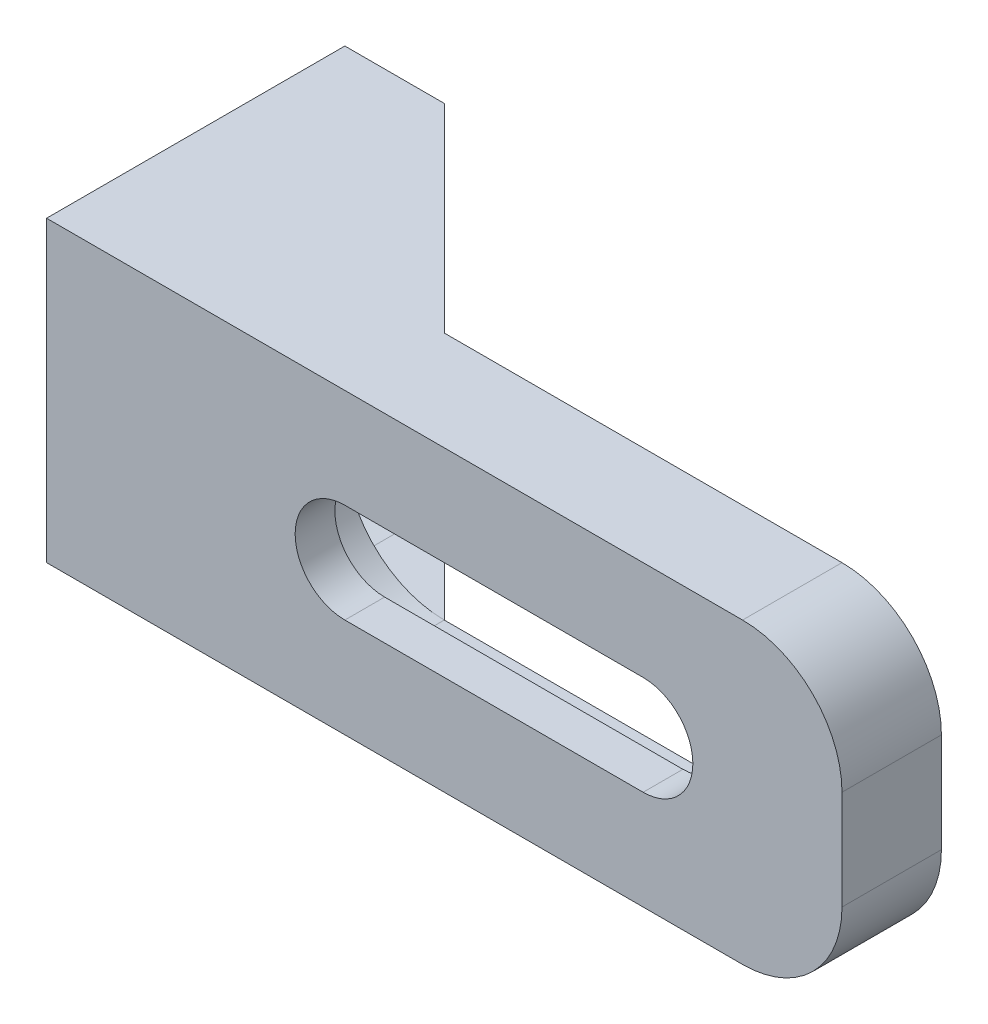
ISO-10303-21;
HEADER;
FILE_DESCRIPTION(('STEP AP214'),'2;1');
FILE_NAME('part.step','',(''),(''),'','','');
FILE_SCHEMA(('AUTOMOTIVE_DESIGN { 1 0 10303 214 1 1 1 1 }'));
ENDSEC;
DATA;
#1=APPLICATION_CONTEXT('core data for automotive mechanical design processes');
#2=APPLICATION_PROTOCOL_DEFINITION('international standard','automotive_design',2000,#1);
#3=PRODUCT_CONTEXT('',#1,'mechanical');
#4=PRODUCT('Part','Part','',(#3));
#5=PRODUCT_RELATED_PRODUCT_CATEGORY('part','',(#4));
#6=PRODUCT_DEFINITION_FORMATION('','',#4);
#7=PRODUCT_DEFINITION_CONTEXT('part definition',#1,'design');
#8=PRODUCT_DEFINITION('design','',#6,#7);
#9=PRODUCT_DEFINITION_SHAPE('','',#8);
#10=(LENGTH_UNIT() NAMED_UNIT(*) SI_UNIT(.MILLI.,.METRE.));
#11=(NAMED_UNIT(*) PLANE_ANGLE_UNIT() SI_UNIT($,.RADIAN.));
#12=(NAMED_UNIT(*) SI_UNIT($,.STERADIAN.) SOLID_ANGLE_UNIT());
#13=UNCERTAINTY_MEASURE_WITH_UNIT(LENGTH_MEASURE(1.E-05),#10,'distance_accuracy_value','');
#14=(GEOMETRIC_REPRESENTATION_CONTEXT(3) GLOBAL_UNCERTAINTY_ASSIGNED_CONTEXT((#13)) GLOBAL_UNIT_ASSIGNED_CONTEXT((#10,
#11,#12)) REPRESENTATION_CONTEXT('',''));
#15=CARTESIAN_POINT('',(0.,0.,0.));
#16=DIRECTION('',(0.,0.,1.));
#17=DIRECTION('',(1.,0.,0.));
#18=AXIS2_PLACEMENT_3D('',#15,#16,#17);
#19=CARTESIAN_POINT('',(-15.,-7.5,-15.));
#20=DIRECTION('',(0.707106781186549,0.,-0.707106781186546));
#21=DIRECTION('',(-0.707106781186546,0.,-0.707106781186549));
#22=AXIS2_PLACEMENT_3D('',#19,#20,#21);
#23=PLANE('',#22);
#24=DIRECTION('',(0.,1.,0.));
#25=VECTOR('',#24,1.);
#26=CARTESIAN_POINT('',(-5.00000000000004,-7.5,-5.));
#27=LINE('',#26,#25);
#28=CARTESIAN_POINT('',(-5.00000000000004,5.,-5.));
#29=VERTEX_POINT('',#28);
#30=CARTESIAN_POINT('',(-5.00000000000004,7.5,-5.));
#31=VERTEX_POINT('',#30);
#32=EDGE_CURVE('E204',#29,#31,#27,.T.);
#33=ORIENTED_EDGE('',*,*,#32,.F.);
#34=DIRECTION('',(-0.707106781186546,0.,-0.707106781186549));
#35=VECTOR('',#34,1.);
#36=CARTESIAN_POINT('',(-15.,5.,-15.));
#37=LINE('',#36,#35);
#38=CARTESIAN_POINT('',(-10.,5.,-9.99999999999998));
#39=VERTEX_POINT('',#38);
#40=EDGE_CURVE('E11',#29,#39,#37,.T.);
#41=ORIENTED_EDGE('',*,*,#40,.T.);
#42=CARTESIAN_POINT('',(-10.,0.,-9.99999999999998));
#43=DIRECTION('',(0.707106781186549,0.,-0.707106781186546));
#44=DIRECTION('',(0.707106781186546,0.,0.707106781186549));
#45=AXIS2_PLACEMENT_3D('',#42,#43,#44);
#46=ELLIPSE('',#45,7.07106781186549,5.);
#47=CARTESIAN_POINT('',(-15.,0.,-15.));
#48=VERTEX_POINT('',#47);
#49=EDGE_CURVE('E43',#48,#39,#46,.T.);
#50=ORIENTED_EDGE('',*,*,#49,.F.);
#51=DIRECTION('',(0.,-1.,0.));
#52=VECTOR('',#51,1.);
#53=CARTESIAN_POINT('',(-15.,0.,-15.));
#54=LINE('',#53,#52);
#55=CARTESIAN_POINT('',(-15.,7.5,-15.));
#56=VERTEX_POINT('',#55);
#57=EDGE_CURVE('E220',#56,#48,#54,.T.);
#58=ORIENTED_EDGE('',*,*,#57,.F.);
#59=DIRECTION('',(-0.707106781186546,0.,-0.707106781186549));
#60=VECTOR('',#59,1.);
#61=CARTESIAN_POINT('',(-15.,7.5,-15.));
#62=LINE('',#61,#60);
#63=EDGE_CURVE('E199',#31,#56,#62,.T.);
#64=ORIENTED_EDGE('',*,*,#63,.F.);
#65=EDGE_LOOP('',(#33,#41,#50,#58,#64));
#66=FACE_BOUND('',#65,.T.);
#67=ADVANCED_FACE('F35',(#66),#23,.T.);
#68=CARTESIAN_POINT('',(0.,0.,-5.));
#69=DIRECTION('',(0.,0.,1.));
#70=DIRECTION('',(1.,0.,0.));
#71=AXIS2_PLACEMENT_3D('',#68,#69,#70);
#72=PLANE('',#71);
#73=DIRECTION('',(1.,0.,0.));
#74=VECTOR('',#73,1.);
#75=CARTESIAN_POINT('',(0.,-7.5,-5.));
#76=LINE('',#75,#74);
#77=CARTESIAN_POINT('',(-5.00000000000004,-7.5,-5.));
#78=VERTEX_POINT('',#77);
#79=CARTESIAN_POINT('',(15.,-7.5,-5.));
#80=VERTEX_POINT('',#79);
#81=EDGE_CURVE('E225',#78,#80,#76,.T.);
#82=ORIENTED_EDGE('',*,*,#81,.F.);
#83=CARTESIAN_POINT('',(-5.00000000000004,-5.,-5.));
#84=VERTEX_POINT('',#83);
#85=EDGE_CURVE('E207',#78,#84,#27,.T.);
#86=ORIENTED_EDGE('',*,*,#85,.T.);
#87=DIRECTION('',(1.,0.,0.));
#88=VECTOR('',#87,1.);
#89=CARTESIAN_POINT('',(0.,-5.,-5.));
#90=LINE('',#89,#88);
#91=CARTESIAN_POINT('',(10.,-5.,-5.));
#92=VERTEX_POINT('',#91);
#93=EDGE_CURVE('E241',#84,#92,#90,.T.);
#94=ORIENTED_EDGE('',*,*,#93,.T.);
#95=CARTESIAN_POINT('',(10.,0.,-5.));
#96=DIRECTION('',(0.,0.,1.));
#97=DIRECTION('',(1.,0.,0.));
#98=AXIS2_PLACEMENT_3D('',#95,#96,#97);
#99=CIRCLE('',#98,5.);
#100=CARTESIAN_POINT('',(10.,5.,-5.));
#101=VERTEX_POINT('',#100);
#102=EDGE_CURVE('E239',#92,#101,#99,.T.);
#103=ORIENTED_EDGE('',*,*,#102,.T.);
#104=DIRECTION('',(1.,0.,0.));
#105=VECTOR('',#104,1.);
#106=CARTESIAN_POINT('',(0.,5.,-5.));
#107=LINE('',#106,#105);
#108=EDGE_CURVE('E237',#29,#101,#107,.T.);
#109=ORIENTED_EDGE('',*,*,#108,.F.);
#110=ORIENTED_EDGE('',*,*,#32,.T.);
#111=DIRECTION('',(1.,0.,0.));
#112=VECTOR('',#111,1.);
#113=CARTESIAN_POINT('',(0.,7.5,-5.));
#114=LINE('',#113,#112);
#115=CARTESIAN_POINT('',(15.,7.5,-5.));
#116=VERTEX_POINT('',#115);
#117=EDGE_CURVE('E223',#31,#116,#114,.T.);
#118=ORIENTED_EDGE('',*,*,#117,.T.);
#119=CARTESIAN_POINT('',(15.,2.5,-5.));
#120=DIRECTION('',(0.,0.,1.));
#121=DIRECTION('',(1.,0.,0.));
#122=AXIS2_PLACEMENT_3D('',#119,#120,#121);
#123=CIRCLE('',#122,5.);
#124=CARTESIAN_POINT('',(20.,2.49999999999996,-5.));
#125=VERTEX_POINT('',#124);
#126=EDGE_CURVE('E233',#125,#116,#123,.T.);
#127=ORIENTED_EDGE('',*,*,#126,.F.);
#128=DIRECTION('',(0.,1.,0.));
#129=VECTOR('',#128,1.);
#130=CARTESIAN_POINT('',(20.,0.,-5.));
#131=LINE('',#130,#129);
#132=CARTESIAN_POINT('',(20.,-2.49999999999996,-5.));
#133=VERTEX_POINT('',#132);
#134=EDGE_CURVE('E230',#133,#125,#131,.T.);
#135=ORIENTED_EDGE('',*,*,#134,.F.);
#136=CARTESIAN_POINT('',(15.,-2.5,-5.));
#137=DIRECTION('',(0.,0.,1.));
#138=DIRECTION('',(1.,0.,0.));
#139=AXIS2_PLACEMENT_3D('',#136,#137,#138);
#140=CIRCLE('',#139,5.);
#141=EDGE_CURVE('E227',#80,#133,#140,.T.);
#142=ORIENTED_EDGE('',*,*,#141,.F.);
#143=EDGE_LOOP('',(#82,#86,#94,#103,#109,#110,#118,#127,#135,#142));
#144=FACE_BOUND('',#143,.T.);
#145=ADVANCED_FACE('F334',(#144),#72,.F.);
#146=CARTESIAN_POINT('',(0.,0.,-2.));
#147=DIRECTION('',(0.,0.,1.));
#148=DIRECTION('',(1.,0.,0.));
#149=AXIS2_PLACEMENT_3D('',#146,#147,#148);
#150=PLANE('',#149);
#151=CARTESIAN_POINT('',(10.,0.,-2.));
#152=DIRECTION('',(0.,0.,1.));
#153=DIRECTION('',(1.,0.,0.));
#154=AXIS2_PLACEMENT_3D('',#151,#152,#153);
#155=CIRCLE('',#154,2.5);
#156=CARTESIAN_POINT('',(10.,-2.5,-2.));
#157=VERTEX_POINT('',#156);
#158=CARTESIAN_POINT('',(10.,2.5,-2.));
#159=VERTEX_POINT('',#158);
#160=EDGE_CURVE('E59',#157,#159,#155,.T.);
#161=ORIENTED_EDGE('',*,*,#160,.T.);
#162=DIRECTION('',(1.,0.,0.));
#163=VECTOR('',#162,1.);
#164=CARTESIAN_POINT('',(0.,2.5,-2.));
#165=LINE('',#164,#163);
#166=CARTESIAN_POINT('',(-5.00000000000001,2.5,-2.));
#167=VERTEX_POINT('',#166);
#168=EDGE_CURVE('E268',#167,#159,#165,.T.);
#169=ORIENTED_EDGE('',*,*,#168,.F.);
#170=CARTESIAN_POINT('',(-5.,0.,-2.));
#171=DIRECTION('',(0.,0.,1.));
#172=DIRECTION('',(1.,0.,0.));
#173=AXIS2_PLACEMENT_3D('',#170,#171,#172);
#174=CIRCLE('',#173,2.5);
#175=CARTESIAN_POINT('',(-5.00000000000001,-2.5,-2.));
#176=VERTEX_POINT('',#175);
#177=EDGE_CURVE('E266',#167,#176,#174,.T.);
#178=ORIENTED_EDGE('',*,*,#177,.T.);
#179=DIRECTION('',(1.,0.,0.));
#180=VECTOR('',#179,1.);
#181=CARTESIAN_POINT('',(0.,-2.5,-2.));
#182=LINE('',#181,#180);
#183=EDGE_CURVE('E104',#176,#157,#182,.T.);
#184=ORIENTED_EDGE('',*,*,#183,.T.);
#185=EDGE_LOOP('',(#161,#169,#178,#184));
#186=FACE_BOUND('',#185,.T.);
#187=CARTESIAN_POINT('',(-5.00000000000001,0.,-2.));
#188=DIRECTION('',(0.,0.,1.));
#189=DIRECTION('',(1.,0.,0.));
#190=AXIS2_PLACEMENT_3D('',#187,#188,#189);
#191=CIRCLE('',#190,5.);
#192=CARTESIAN_POINT('',(-5.00000000000001,5.,-2.));
#193=VERTEX_POINT('',#192);
#194=CARTESIAN_POINT('',(-5.,-5.,-2.));
#195=VERTEX_POINT('',#194);
#196=EDGE_CURVE('E260',#193,#195,#191,.T.);
#197=ORIENTED_EDGE('',*,*,#196,.F.);
#198=DIRECTION('',(1.,0.,0.));
#199=VECTOR('',#198,1.);
#200=CARTESIAN_POINT('',(0.,5.,-2.));
#201=LINE('',#200,#199);
#202=CARTESIAN_POINT('',(10.,5.,-2.));
#203=VERTEX_POINT('',#202);
#204=EDGE_CURVE('E247',#193,#203,#201,.T.);
#205=ORIENTED_EDGE('',*,*,#204,.T.);
#206=CARTESIAN_POINT('',(10.,0.,-2.));
#207=DIRECTION('',(0.,0.,1.));
#208=DIRECTION('',(1.,0.,0.));
#209=AXIS2_PLACEMENT_3D('',#206,#207,#208);
#210=CIRCLE('',#209,5.);
#211=CARTESIAN_POINT('',(10.,-5.,-2.));
#212=VERTEX_POINT('',#211);
#213=EDGE_CURVE('E256',#212,#203,#210,.T.);
#214=ORIENTED_EDGE('',*,*,#213,.F.);
#215=DIRECTION('',(1.,0.,0.));
#216=VECTOR('',#215,1.);
#217=CARTESIAN_POINT('',(0.,-5.,-2.));
#218=LINE('',#217,#216);
#219=EDGE_CURVE('E258',#195,#212,#218,.T.);
#220=ORIENTED_EDGE('',*,*,#219,.F.);
#221=EDGE_LOOP('',(#197,#205,#214,#220));
#222=FACE_BOUND('',#221,.T.);
#223=ADVANCED_FACE('F343',(#186,#222),#150,.F.);
#224=CARTESIAN_POINT('',(10.,0.,-2.));
#225=DIRECTION('',(0.,0.,1.));
#226=DIRECTION('',(1.,0.,0.));
#227=AXIS2_PLACEMENT_3D('',#224,#225,#226);
#228=CYLINDRICAL_SURFACE('',#227,2.5);
#229=CARTESIAN_POINT('',(10.,0.,0.));
#230=DIRECTION('',(0.,0.,1.));
#231=DIRECTION('',(1.,0.,0.));
#232=AXIS2_PLACEMENT_3D('',#229,#230,#231);
#233=CIRCLE('',#232,2.5);
#234=CARTESIAN_POINT('',(10.,-2.5,0.));
#235=VERTEX_POINT('',#234);
#236=CARTESIAN_POINT('',(10.,2.5,0.));
#237=VERTEX_POINT('',#236);
#238=EDGE_CURVE('E285',#235,#237,#233,.T.);
#239=ORIENTED_EDGE('',*,*,#238,.T.);
#240=DIRECTION('',(0.,0.,1.));
#241=VECTOR('',#240,1.);
#242=CARTESIAN_POINT('',(10.,2.5,-2.));
#243=LINE('',#242,#241);
#244=EDGE_CURVE('E99',#159,#237,#243,.T.);
#245=ORIENTED_EDGE('',*,*,#244,.F.);
#246=ORIENTED_EDGE('',*,*,#160,.F.);
#247=DIRECTION('',(0.,0.,1.));
#248=VECTOR('',#247,1.);
#249=CARTESIAN_POINT('',(10.,-2.5,-2.));
#250=LINE('',#249,#248);
#251=EDGE_CURVE('E299',#157,#235,#250,.T.);
#252=ORIENTED_EDGE('',*,*,#251,.T.);
#253=EDGE_LOOP('',(#239,#245,#246,#252));
#254=FACE_BOUND('',#253,.T.);
#255=ADVANCED_FACE('F408',(#254),#228,.F.);
#256=CARTESIAN_POINT('',(0.,2.5,-2.));
#257=DIRECTION('',(0.,-1.,0.));
#258=DIRECTION('',(1.,0.,0.));
#259=AXIS2_PLACEMENT_3D('',#256,#257,#258);
#260=PLANE('',#259);
#261=DIRECTION('',(1.,0.,0.));
#262=VECTOR('',#261,1.);
#263=CARTESIAN_POINT('',(0.,2.5,0.));
#264=LINE('',#263,#262);
#265=CARTESIAN_POINT('',(-5.00000000000001,2.5,0.));
#266=VERTEX_POINT('',#265);
#267=EDGE_CURVE('E264',#266,#237,#264,.T.);
#268=ORIENTED_EDGE('',*,*,#267,.F.);
#269=DIRECTION('',(0.,0.,1.));
#270=VECTOR('',#269,1.);
#271=CARTESIAN_POINT('',(-5.00000000000001,2.5,-2.));
#272=LINE('',#271,#270);
#273=EDGE_CURVE('E294',#167,#266,#272,.T.);
#274=ORIENTED_EDGE('',*,*,#273,.F.);
#275=ORIENTED_EDGE('',*,*,#168,.T.);
#276=ORIENTED_EDGE('',*,*,#244,.T.);
#277=EDGE_LOOP('',(#268,#274,#275,#276));
#278=FACE_BOUND('',#277,.T.);
#279=ADVANCED_FACE('F414',(#278),#260,.T.);
#280=CARTESIAN_POINT('',(-5.,0.,-2.));
#281=DIRECTION('',(0.,0.,1.));
#282=DIRECTION('',(1.,0.,0.));
#283=AXIS2_PLACEMENT_3D('',#280,#281,#282);
#284=CYLINDRICAL_SURFACE('',#283,2.5);
#285=CARTESIAN_POINT('',(-5.,0.,0.));
#286=DIRECTION('',(0.,0.,1.));
#287=DIRECTION('',(1.,0.,0.));
#288=AXIS2_PLACEMENT_3D('',#285,#286,#287);
#289=CIRCLE('',#288,2.5);
#290=CARTESIAN_POINT('',(-5.00000000000001,-2.5,0.));
#291=VERTEX_POINT('',#290);
#292=EDGE_CURVE('E289',#266,#291,#289,.T.);
#293=ORIENTED_EDGE('',*,*,#292,.T.);
#294=DIRECTION('',(0.,0.,1.));
#295=VECTOR('',#294,1.);
#296=CARTESIAN_POINT('',(-5.00000000000001,-2.5,-2.));
#297=LINE('',#296,#295);
#298=EDGE_CURVE('E296',#176,#291,#297,.T.);
#299=ORIENTED_EDGE('',*,*,#298,.F.);
#300=ORIENTED_EDGE('',*,*,#177,.F.);
#301=ORIENTED_EDGE('',*,*,#273,.T.);
#302=EDGE_LOOP('',(#293,#299,#300,#301));
#303=FACE_BOUND('',#302,.T.);
#304=ADVANCED_FACE('F413',(#303),#284,.F.);
#305=CARTESIAN_POINT('',(0.,7.5,-2.));
#306=DIRECTION('',(0.,-1.,0.));
#307=DIRECTION('',(0.,0.,-1.));
#308=AXIS2_PLACEMENT_3D('',#305,#306,#307);
#309=PLANE('',#308);
#310=ORIENTED_EDGE('',*,*,#117,.F.);
#311=ORIENTED_EDGE('',*,*,#63,.T.);
#312=DIRECTION('',(1.,0.,0.));
#313=VECTOR('',#312,1.);
#314=CARTESIAN_POINT('',(0.,7.5,-15.));
#315=LINE('',#314,#313);
#316=CARTESIAN_POINT('',(-20.,7.5,-15.));
#317=VERTEX_POINT('',#316);
#318=EDGE_CURVE('E210',#317,#56,#315,.T.);
#319=ORIENTED_EDGE('',*,*,#318,.F.);
#320=DIRECTION('',(0.,0.,1.));
#321=VECTOR('',#320,1.);
#322=CARTESIAN_POINT('',(-20.,7.5,-2.));
#323=LINE('',#322,#321);
#324=CARTESIAN_POINT('',(-20.,7.5,0.));
#325=VERTEX_POINT('',#324);
#326=EDGE_CURVE('E270',#317,#325,#323,.T.);
#327=ORIENTED_EDGE('',*,*,#326,.T.);
#328=DIRECTION('',(1.,0.,0.));
#329=VECTOR('',#328,1.);
#330=CARTESIAN_POINT('',(0.,7.5,0.));
#331=LINE('',#330,#329);
#332=CARTESIAN_POINT('',(15.,7.5,0.));
#333=VERTEX_POINT('',#332);
#334=EDGE_CURVE('E262',#325,#333,#331,.T.);
#335=ORIENTED_EDGE('',*,*,#334,.T.);
#336=DIRECTION('',(0.,0.,1.));
#337=VECTOR('',#336,1.);
#338=CARTESIAN_POINT('',(15.,7.5,-2.));
#339=LINE('',#338,#337);
#340=EDGE_CURVE('E302',#116,#333,#339,.T.);
#341=ORIENTED_EDGE('',*,*,#340,.F.);
#342=EDGE_LOOP('',(#310,#311,#319,#327,#335,#341));
#343=FACE_BOUND('',#342,.T.);
#344=ADVANCED_FACE('F37',(#343),#309,.F.);
#345=CARTESIAN_POINT('',(15.,2.5,-2.));
#346=DIRECTION('',(0.,0.,1.));
#347=DIRECTION('',(1.,0.,0.));
#348=AXIS2_PLACEMENT_3D('',#345,#346,#347);
#349=CYLINDRICAL_SURFACE('',#348,5.);
#350=CARTESIAN_POINT('',(15.,2.5,0.));
#351=DIRECTION('',(0.,0.,1.));
#352=DIRECTION('',(1.,0.,0.));
#353=AXIS2_PLACEMENT_3D('',#350,#351,#352);
#354=CIRCLE('',#353,5.);
#355=CARTESIAN_POINT('',(20.,2.49999999999996,0.));
#356=VERTEX_POINT('',#355);
#357=EDGE_CURVE('E282',#356,#333,#354,.T.);
#358=ORIENTED_EDGE('',*,*,#357,.F.);
#359=DIRECTION('',(0.,0.,1.));
#360=VECTOR('',#359,1.);
#361=CARTESIAN_POINT('',(20.,2.49999999999996,-2.));
#362=LINE('',#361,#360);
#363=EDGE_CURVE('E305',#125,#356,#362,.T.);
#364=ORIENTED_EDGE('',*,*,#363,.F.);
#365=ORIENTED_EDGE('',*,*,#126,.T.);
#366=ORIENTED_EDGE('',*,*,#340,.T.);
#367=EDGE_LOOP('',(#358,#364,#365,#366));
#368=FACE_BOUND('',#367,.T.);
#369=ADVANCED_FACE('F383',(#368),#349,.T.);
#370=CARTESIAN_POINT('',(20.,0.,-2.));
#371=DIRECTION('',(1.,0.,0.));
#372=DIRECTION('',(0.,0.,-1.));
#373=AXIS2_PLACEMENT_3D('',#370,#371,#372);
#374=PLANE('',#373);
#375=DIRECTION('',(0.,1.,0.));
#376=VECTOR('',#375,1.);
#377=CARTESIAN_POINT('',(20.,0.,0.));
#378=LINE('',#377,#376);
#379=CARTESIAN_POINT('',(20.,-2.49999999999996,0.));
#380=VERTEX_POINT('',#379);
#381=EDGE_CURVE('E279',#380,#356,#378,.T.);
#382=ORIENTED_EDGE('',*,*,#381,.F.);
#383=DIRECTION('',(0.,0.,1.));
#384=VECTOR('',#383,1.);
#385=CARTESIAN_POINT('',(20.,-2.49999999999996,-2.));
#386=LINE('',#385,#384);
#387=EDGE_CURVE('E307',#133,#380,#386,.T.);
#388=ORIENTED_EDGE('',*,*,#387,.F.);
#389=ORIENTED_EDGE('',*,*,#134,.T.);
#390=ORIENTED_EDGE('',*,*,#363,.T.);
#391=EDGE_LOOP('',(#382,#388,#389,#390));
#392=FACE_BOUND('',#391,.T.);
#393=ADVANCED_FACE('F386',(#392),#374,.T.);
#394=CARTESIAN_POINT('',(15.,-2.5,-2.));
#395=DIRECTION('',(0.,0.,1.));
#396=DIRECTION('',(1.,0.,0.));
#397=AXIS2_PLACEMENT_3D('',#394,#395,#396);
#398=CYLINDRICAL_SURFACE('',#397,5.);
#399=CARTESIAN_POINT('',(15.,-2.5,0.));
#400=DIRECTION('',(0.,0.,1.));
#401=DIRECTION('',(1.,0.,0.));
#402=AXIS2_PLACEMENT_3D('',#399,#400,#401);
#403=CIRCLE('',#402,5.);
#404=CARTESIAN_POINT('',(15.,-7.5,0.));
#405=VERTEX_POINT('',#404);
#406=EDGE_CURVE('E276',#405,#380,#403,.T.);
#407=ORIENTED_EDGE('',*,*,#406,.F.);
#408=DIRECTION('',(0.,0.,1.));
#409=VECTOR('',#408,1.);
#410=CARTESIAN_POINT('',(15.,-7.5,-2.));
#411=LINE('',#410,#409);
#412=EDGE_CURVE('E309',#80,#405,#411,.T.);
#413=ORIENTED_EDGE('',*,*,#412,.F.);
#414=ORIENTED_EDGE('',*,*,#141,.T.);
#415=ORIENTED_EDGE('',*,*,#387,.T.);
#416=EDGE_LOOP('',(#407,#413,#414,#415));
#417=FACE_BOUND('',#416,.T.);
#418=ADVANCED_FACE('F389',(#417),#398,.T.);
#419=CARTESIAN_POINT('',(0.,-7.5,-2.));
#420=DIRECTION('',(0.,-1.,0.));
#421=DIRECTION('',(0.,0.,-1.));
#422=AXIS2_PLACEMENT_3D('',#419,#420,#421);
#423=PLANE('',#422);
#424=DIRECTION('',(-0.707106781186546,0.,-0.707106781186549));
#425=VECTOR('',#424,1.);
#426=CARTESIAN_POINT('',(-15.,-7.5,-15.));
#427=LINE('',#426,#425);
#428=CARTESIAN_POINT('',(-15.,-7.5,-15.));
#429=VERTEX_POINT('',#428);
#430=EDGE_CURVE('E201',#78,#429,#427,.T.);
#431=ORIENTED_EDGE('',*,*,#430,.F.);
#432=ORIENTED_EDGE('',*,*,#81,.T.);
#433=ORIENTED_EDGE('',*,*,#412,.T.);
#434=DIRECTION('',(1.,0.,0.));
#435=VECTOR('',#434,1.);
#436=CARTESIAN_POINT('',(0.,-7.5,0.));
#437=LINE('',#436,#435);
#438=CARTESIAN_POINT('',(-20.,-7.5,0.));
#439=VERTEX_POINT('',#438);
#440=EDGE_CURVE('E274',#439,#405,#437,.T.);
#441=ORIENTED_EDGE('',*,*,#440,.F.);
#442=DIRECTION('',(0.,0.,1.));
#443=VECTOR('',#442,1.);
#444=CARTESIAN_POINT('',(-20.,-7.5,-2.));
#445=LINE('',#444,#443);
#446=CARTESIAN_POINT('',(-20.,-7.5,-15.));
#447=VERTEX_POINT('',#446);
#448=EDGE_CURVE('E312',#447,#439,#445,.T.);
#449=ORIENTED_EDGE('',*,*,#448,.F.);
#450=DIRECTION('',(1.,0.,0.));
#451=VECTOR('',#450,1.);
#452=CARTESIAN_POINT('',(0.,-7.5,-15.));
#453=LINE('',#452,#451);
#454=EDGE_CURVE('E216',#447,#429,#453,.T.);
#455=ORIENTED_EDGE('',*,*,#454,.T.);
#456=EDGE_LOOP('',(#431,#432,#433,#441,#449,#455));
#457=FACE_BOUND('',#456,.T.);
#458=ADVANCED_FACE('F392',(#457),#423,.T.);
#459=CARTESIAN_POINT('',(-20.,0.,-2.));
#460=DIRECTION('',(1.,0.,0.));
#461=DIRECTION('',(0.,0.,-1.));
#462=AXIS2_PLACEMENT_3D('',#459,#460,#461);
#463=PLANE('',#462);
#464=DIRECTION('',(0.,1.,0.));
#465=VECTOR('',#464,1.);
#466=CARTESIAN_POINT('',(-20.,0.,0.));
#467=LINE('',#466,#465);
#468=EDGE_CURVE('E272',#439,#325,#467,.T.);
#469=ORIENTED_EDGE('',*,*,#468,.T.);
#470=ORIENTED_EDGE('',*,*,#326,.F.);
#471=DIRECTION('',(0.,1.,0.));
#472=VECTOR('',#471,1.);
#473=CARTESIAN_POINT('',(-20.,0.,-15.));
#474=LINE('',#473,#472);
#475=EDGE_CURVE('E213',#447,#317,#474,.T.);
#476=ORIENTED_EDGE('',*,*,#475,.F.);
#477=ORIENTED_EDGE('',*,*,#448,.T.);
#478=EDGE_LOOP('',(#469,#470,#476,#477));
#479=FACE_BOUND('',#478,.T.);
#480=ADVANCED_FACE('F396',(#479),#463,.F.);
#481=CARTESIAN_POINT('',(0.,-2.5,-2.));
#482=DIRECTION('',(0.,-1.,0.));
#483=DIRECTION('',(1.,0.,0.));
#484=AXIS2_PLACEMENT_3D('',#481,#482,#483);
#485=PLANE('',#484);
#486=DIRECTION('',(1.,0.,0.));
#487=VECTOR('',#486,1.);
#488=CARTESIAN_POINT('',(0.,-2.5,0.));
#489=LINE('',#488,#487);
#490=EDGE_CURVE('E287',#291,#235,#489,.T.);
#491=ORIENTED_EDGE('',*,*,#490,.T.);
#492=ORIENTED_EDGE('',*,*,#251,.F.);
#493=ORIENTED_EDGE('',*,*,#183,.F.);
#494=ORIENTED_EDGE('',*,*,#298,.T.);
#495=EDGE_LOOP('',(#491,#492,#493,#494));
#496=FACE_BOUND('',#495,.T.);
#497=ADVANCED_FACE('F402',(#496),#485,.F.);
#498=CARTESIAN_POINT('',(0.,0.,0.));
#499=DIRECTION('',(0.,0.,1.));
#500=DIRECTION('',(1.,0.,0.));
#501=AXIS2_PLACEMENT_3D('',#498,#499,#500);
#502=PLANE('',#501);
#503=ORIENTED_EDGE('',*,*,#440,.T.);
#504=ORIENTED_EDGE('',*,*,#406,.T.);
#505=ORIENTED_EDGE('',*,*,#381,.T.);
#506=ORIENTED_EDGE('',*,*,#357,.T.);
#507=ORIENTED_EDGE('',*,*,#334,.F.);
#508=ORIENTED_EDGE('',*,*,#468,.F.);
#509=EDGE_LOOP('',(#503,#504,#505,#506,#507,#508));
#510=FACE_BOUND('',#509,.T.);
#511=ORIENTED_EDGE('',*,*,#238,.F.);
#512=ORIENTED_EDGE('',*,*,#490,.F.);
#513=ORIENTED_EDGE('',*,*,#292,.F.);
#514=ORIENTED_EDGE('',*,*,#267,.T.);
#515=EDGE_LOOP('',(#511,#512,#513,#514));
#516=FACE_BOUND('',#515,.T.);
#517=ADVANCED_FACE('F353',(#510,#516),#502,.T.);
#518=CARTESIAN_POINT('',(-5.00000000000001,0.,-5.));
#519=DIRECTION('',(0.,0.,1.));
#520=DIRECTION('',(1.,0.,0.));
#521=AXIS2_PLACEMENT_3D('',#518,#519,#520);
#522=CYLINDRICAL_SURFACE('',#521,5.);
#523=DIRECTION('',(0.,0.,1.));
#524=VECTOR('',#523,1.);
#525=CARTESIAN_POINT('',(-5.00000000000001,5.,-5.));
#526=LINE('',#525,#524);
#527=EDGE_CURVE('E243',#29,#193,#526,.T.);
#528=ORIENTED_EDGE('',*,*,#527,.T.);
#529=ORIENTED_EDGE('',*,*,#196,.T.);
#530=DIRECTION('',(0.,0.,1.));
#531=VECTOR('',#530,1.);
#532=CARTESIAN_POINT('',(-5.,-5.,-5.));
#533=LINE('',#532,#531);
#534=EDGE_CURVE('E244',#84,#195,#533,.T.);
#535=ORIENTED_EDGE('',*,*,#534,.F.);
#536=CARTESIAN_POINT('',(-5.00000000000001,0.,-5.));
#537=DIRECTION('',(0.,0.,1.));
#538=DIRECTION('',(1.,0.,0.));
#539=AXIS2_PLACEMENT_3D('',#536,#537,#538);
#540=CIRCLE('',#539,5.);
#541=EDGE_CURVE('E191',#29,#84,#540,.T.);
#542=ORIENTED_EDGE('',*,*,#541,.F.);
#543=EDGE_LOOP('',(#528,#529,#535,#542));
#544=FACE_BOUND('',#543,.T.);
#545=ADVANCED_FACE('F332',(#544),#522,.F.);
#546=CARTESIAN_POINT('',(0.,-5.,-5.));
#547=DIRECTION('',(0.,-1.,0.));
#548=DIRECTION('',(0.,0.,-1.));
#549=AXIS2_PLACEMENT_3D('',#546,#547,#548);
#550=PLANE('',#549);
#551=ORIENTED_EDGE('',*,*,#534,.T.);
#552=ORIENTED_EDGE('',*,*,#219,.T.);
#553=DIRECTION('',(0.,0.,1.));
#554=VECTOR('',#553,1.);
#555=CARTESIAN_POINT('',(10.,-5.,-5.));
#556=LINE('',#555,#554);
#557=EDGE_CURVE('E248',#92,#212,#556,.T.);
#558=ORIENTED_EDGE('',*,*,#557,.F.);
#559=ORIENTED_EDGE('',*,*,#93,.F.);
#560=EDGE_LOOP('',(#551,#552,#558,#559));
#561=FACE_BOUND('',#560,.T.);
#562=ADVANCED_FACE('F345',(#561),#550,.F.);
#563=CARTESIAN_POINT('',(10.,0.,-5.));
#564=DIRECTION('',(0.,0.,1.));
#565=DIRECTION('',(1.,0.,0.));
#566=AXIS2_PLACEMENT_3D('',#563,#564,#565);
#567=CYLINDRICAL_SURFACE('',#566,5.);
#568=ORIENTED_EDGE('',*,*,#557,.T.);
#569=ORIENTED_EDGE('',*,*,#213,.T.);
#570=DIRECTION('',(0.,0.,1.));
#571=VECTOR('',#570,1.);
#572=CARTESIAN_POINT('',(10.,5.,-5.));
#573=LINE('',#572,#571);
#574=EDGE_CURVE('E50',#101,#203,#573,.T.);
#575=ORIENTED_EDGE('',*,*,#574,.F.);
#576=ORIENTED_EDGE('',*,*,#102,.F.);
#577=EDGE_LOOP('',(#568,#569,#575,#576));
#578=FACE_BOUND('',#577,.T.);
#579=ADVANCED_FACE('F339',(#578),#567,.F.);
#580=CARTESIAN_POINT('',(0.,5.,-5.));
#581=DIRECTION('',(0.,-1.,0.));
#582=DIRECTION('',(0.,0.,-1.));
#583=AXIS2_PLACEMENT_3D('',#580,#581,#582);
#584=PLANE('',#583);
#585=ORIENTED_EDGE('',*,*,#204,.F.);
#586=ORIENTED_EDGE('',*,*,#527,.F.);
#587=ORIENTED_EDGE('',*,*,#108,.T.);
#588=ORIENTED_EDGE('',*,*,#574,.T.);
#589=EDGE_LOOP('',(#585,#586,#587,#588));
#590=FACE_BOUND('',#589,.T.);
#591=ADVANCED_FACE('F328',(#590),#584,.T.);
#592=CARTESIAN_POINT('',(0.,0.,-15.));
#593=DIRECTION('',(0.,0.,1.));
#594=DIRECTION('',(1.,0.,0.));
#595=AXIS2_PLACEMENT_3D('',#592,#593,#594);
#596=PLANE('',#595);
#597=ORIENTED_EDGE('',*,*,#318,.T.);
#598=ORIENTED_EDGE('',*,*,#57,.T.);
#599=EDGE_CURVE('E219',#48,#429,#54,.T.);
#600=ORIENTED_EDGE('',*,*,#599,.T.);
#601=ORIENTED_EDGE('',*,*,#454,.F.);
#602=ORIENTED_EDGE('',*,*,#475,.T.);
#603=EDGE_LOOP('',(#597,#598,#600,#601,#602));
#604=FACE_BOUND('',#603,.T.);
#605=ADVANCED_FACE('F365',(#604),#596,.F.);
#606=CARTESIAN_POINT('',(-10.,-5.,-9.99999999999998));
#607=VERTEX_POINT('',#606);
#608=EDGE_CURVE('E316',#607,#48,#46,.T.);
#609=ORIENTED_EDGE('',*,*,#608,.F.);
#610=DIRECTION('',(-0.707106781186546,0.,-0.707106781186549));
#611=VECTOR('',#610,1.);
#612=CARTESIAN_POINT('',(-15.,-5.,-15.));
#613=LINE('',#612,#611);
#614=EDGE_CURVE('E178',#84,#607,#613,.T.);
#615=ORIENTED_EDGE('',*,*,#614,.F.);
#616=ORIENTED_EDGE('',*,*,#85,.F.);
#617=ORIENTED_EDGE('',*,*,#430,.T.);
#618=ORIENTED_EDGE('',*,*,#599,.F.);
#619=EDGE_LOOP('',(#609,#615,#616,#617,#618));
#620=FACE_BOUND('',#619,.T.);
#621=ADVANCED_FACE('F358',(#620),#23,.T.);
#622=CARTESIAN_POINT('',(-10.,0.,-5.));
#623=DIRECTION('',(0.,0.,1.));
#624=DIRECTION('',(1.,0.,0.));
#625=AXIS2_PLACEMENT_3D('',#622,#623,#624);
#626=PLANE('',#625);
#627=DIRECTION('',(1.,0.,0.));
#628=VECTOR('',#627,1.);
#629=CARTESIAN_POINT('',(-10.,-5.,-5.));
#630=LINE('',#629,#628);
#631=CARTESIAN_POINT('',(-10.,-5.,-5.));
#632=VERTEX_POINT('',#631);
#633=EDGE_CURVE('E175',#632,#84,#630,.T.);
#634=ORIENTED_EDGE('',*,*,#633,.F.);
#635=CARTESIAN_POINT('',(-10.,0.,-5.));
#636=DIRECTION('',(0.,0.,1.));
#637=DIRECTION('',(1.,0.,0.));
#638=AXIS2_PLACEMENT_3D('',#635,#636,#637);
#639=CIRCLE('',#638,5.);
#640=CARTESIAN_POINT('',(-10.,5.,-5.));
#641=VERTEX_POINT('',#640);
#642=EDGE_CURVE('E189',#641,#632,#639,.T.);
#643=ORIENTED_EDGE('',*,*,#642,.F.);
#644=DIRECTION('',(1.,0.,0.));
#645=VECTOR('',#644,1.);
#646=CARTESIAN_POINT('',(-10.,5.,-5.));
#647=LINE('',#646,#645);
#648=EDGE_CURVE('E183',#641,#29,#647,.T.);
#649=ORIENTED_EDGE('',*,*,#648,.T.);
#650=ORIENTED_EDGE('',*,*,#541,.T.);
#651=EDGE_LOOP('',(#634,#643,#649,#650));
#652=FACE_BOUND('',#651,.T.);
#653=ADVANCED_FACE('F187',(#652),#626,.F.);
#654=CARTESIAN_POINT('',(-10.,0.,-20.));
#655=DIRECTION('',(0.,0.,1.));
#656=DIRECTION('',(1.,0.,0.));
#657=AXIS2_PLACEMENT_3D('',#654,#655,#656);
#658=CYLINDRICAL_SURFACE('',#657,5.);
#659=ORIENTED_EDGE('',*,*,#608,.T.);
#660=ORIENTED_EDGE('',*,*,#49,.T.);
#661=DIRECTION('',(0.,0.,1.));
#662=VECTOR('',#661,1.);
#663=CARTESIAN_POINT('',(-10.,5.,-20.));
#664=LINE('',#663,#662);
#665=EDGE_CURVE('E182',#39,#641,#664,.T.);
#666=ORIENTED_EDGE('',*,*,#665,.T.);
#667=ORIENTED_EDGE('',*,*,#642,.T.);
#668=DIRECTION('',(0.,0.,1.));
#669=VECTOR('',#668,1.);
#670=CARTESIAN_POINT('',(-10.,-5.,-20.));
#671=LINE('',#670,#669);
#672=EDGE_CURVE('E172',#607,#632,#671,.T.);
#673=ORIENTED_EDGE('',*,*,#672,.F.);
#674=EDGE_LOOP('',(#659,#660,#666,#667,#673));
#675=FACE_BOUND('',#674,.T.);
#676=ADVANCED_FACE('F193',(#675),#658,.F.);
#677=CARTESIAN_POINT('',(-10.,5.,-20.));
#678=DIRECTION('',(0.,-1.,0.));
#679=DIRECTION('',(0.,0.,-1.));
#680=AXIS2_PLACEMENT_3D('',#677,#678,#679);
#681=PLANE('',#680);
#682=ORIENTED_EDGE('',*,*,#648,.F.);
#683=ORIENTED_EDGE('',*,*,#665,.F.);
#684=ORIENTED_EDGE('',*,*,#40,.F.);
#685=EDGE_LOOP('',(#682,#683,#684));
#686=FACE_BOUND('',#685,.T.);
#687=ADVANCED_FACE('F321',(#686),#681,.T.);
#688=CARTESIAN_POINT('',(-10.,-5.,-20.));
#689=DIRECTION('',(0.,-1.,0.));
#690=DIRECTION('',(0.,0.,-1.));
#691=AXIS2_PLACEMENT_3D('',#688,#689,#690);
#692=PLANE('',#691);
#693=ORIENTED_EDGE('',*,*,#614,.T.);
#694=ORIENTED_EDGE('',*,*,#672,.T.);
#695=ORIENTED_EDGE('',*,*,#633,.T.);
#696=EDGE_LOOP('',(#693,#694,#695));
#697=FACE_BOUND('',#696,.T.);
#698=ADVANCED_FACE('F174',(#697),#692,.F.);
#699=CLOSED_SHELL('',(#67,#145,#223,#255,#279,#304,#344,#369,#393,#418,#458,#480,#497,#517,#545,
#562,#579,#591,#605,#621,#653,#676,#687,#698));
#700=MANIFOLD_SOLID_BREP('B2',#699);
#701=ADVANCED_BREP_SHAPE_REPRESENTATION('',(#18,#700),#14);
#702=SHAPE_DEFINITION_REPRESENTATION(#9,#701);
ENDSEC;
END-ISO-10303-21;
